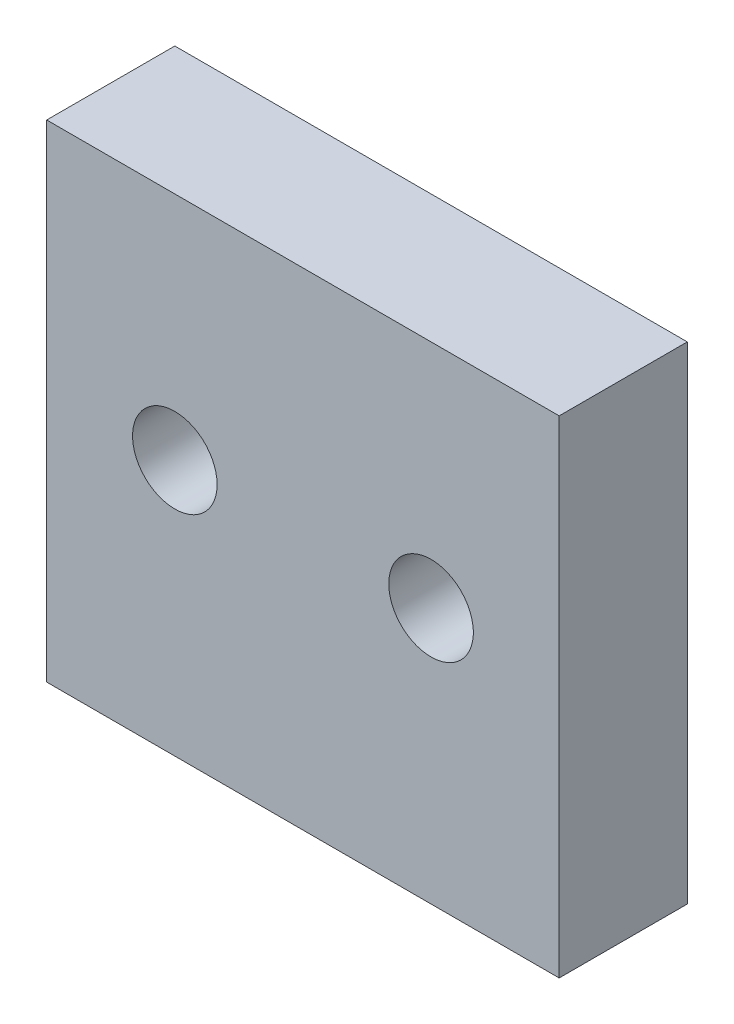
ISO-10303-21;
HEADER;
FILE_DESCRIPTION(('STEP AP214'),'2;1');
FILE_NAME('part.step','',(''),(''),'','','');
FILE_SCHEMA(('AUTOMOTIVE_DESIGN { 1 0 10303 214 1 1 1 1 }'));
ENDSEC;
DATA;
#1=APPLICATION_CONTEXT('core data for automotive mechanical design processes');
#2=APPLICATION_PROTOCOL_DEFINITION('international standard','automotive_design',2000,#1);
#3=PRODUCT_CONTEXT('',#1,'mechanical');
#4=PRODUCT('Part','Part','',(#3));
#5=PRODUCT_RELATED_PRODUCT_CATEGORY('part','',(#4));
#6=PRODUCT_DEFINITION_FORMATION('','',#4);
#7=PRODUCT_DEFINITION_CONTEXT('part definition',#1,'design');
#8=PRODUCT_DEFINITION('design','',#6,#7);
#9=PRODUCT_DEFINITION_SHAPE('','',#8);
#10=(LENGTH_UNIT() NAMED_UNIT(*) SI_UNIT(.MILLI.,.METRE.));
#11=(NAMED_UNIT(*) PLANE_ANGLE_UNIT() SI_UNIT($,.RADIAN.));
#12=(NAMED_UNIT(*) SI_UNIT($,.STERADIAN.) SOLID_ANGLE_UNIT());
#13=UNCERTAINTY_MEASURE_WITH_UNIT(LENGTH_MEASURE(1.E-05),#10,'distance_accuracy_value','');
#14=(GEOMETRIC_REPRESENTATION_CONTEXT(3) GLOBAL_UNCERTAINTY_ASSIGNED_CONTEXT((#13)) GLOBAL_UNIT_ASSIGNED_CONTEXT((#10,
#11,#12)) REPRESENTATION_CONTEXT('',''));
#15=CARTESIAN_POINT('',(0.,0.,0.));
#16=DIRECTION('',(0.,0.,1.));
#17=DIRECTION('',(1.,0.,0.));
#18=AXIS2_PLACEMENT_3D('',#15,#16,#17);
#19=CARTESIAN_POINT('',(0.,0.,5.));
#20=DIRECTION('',(0.,0.,1.));
#21=DIRECTION('',(1.,0.,0.));
#22=AXIS2_PLACEMENT_3D('',#19,#20,#21);
#23=PLANE('',#22);
#24=DIRECTION('',(1.,0.,0.));
#25=VECTOR('',#24,1.);
#26=CARTESIAN_POINT('',(-10.,9.,5.));
#27=LINE('',#26,#25);
#28=CARTESIAN_POINT('',(-10.,9.,5.));
#29=VERTEX_POINT('',#28);
#30=CARTESIAN_POINT('',(10.,9.,5.));
#31=VERTEX_POINT('',#30);
#32=EDGE_CURVE('E133',#29,#31,#27,.T.);
#33=ORIENTED_EDGE('',*,*,#32,.F.);
#34=DIRECTION('',(0.,-1.,0.));
#35=VECTOR('',#34,1.);
#36=CARTESIAN_POINT('',(-10.,10.,5.));
#37=LINE('',#36,#35);
#38=CARTESIAN_POINT('',(-10.,-10.,5.));
#39=VERTEX_POINT('',#38);
#40=EDGE_CURVE('E111',#29,#39,#37,.T.);
#41=ORIENTED_EDGE('',*,*,#40,.T.);
#42=DIRECTION('',(1.,0.,0.));
#43=VECTOR('',#42,1.);
#44=CARTESIAN_POINT('',(-10.,-10.,5.));
#45=LINE('',#44,#43);
#46=CARTESIAN_POINT('',(10.,-10.,5.));
#47=VERTEX_POINT('',#46);
#48=EDGE_CURVE('E68',#39,#47,#45,.T.);
#49=ORIENTED_EDGE('',*,*,#48,.T.);
#50=DIRECTION('',(0.,1.,0.));
#51=VECTOR('',#50,1.);
#52=CARTESIAN_POINT('',(10.,10.,5.));
#53=LINE('',#52,#51);
#54=EDGE_CURVE('E89',#47,#31,#53,.T.);
#55=ORIENTED_EDGE('',*,*,#54,.T.);
#56=EDGE_LOOP('',(#33,#41,#49,#55));
#57=FACE_BOUND('',#56,.T.);
#58=CARTESIAN_POINT('',(-5.,0.,5.));
#59=DIRECTION('',(0.,0.,1.));
#60=DIRECTION('',(1.,0.,0.));
#61=AXIS2_PLACEMENT_3D('',#58,#59,#60);
#62=CIRCLE('',#61,1.65);
#63=CARTESIAN_POINT('',(-3.35,0.,5.));
#64=VERTEX_POINT('',#63);
#65=EDGE_CURVE('E100',#64,#64,#62,.T.);
#66=ORIENTED_EDGE('',*,*,#65,.F.);
#67=EDGE_LOOP('',(#66));
#68=FACE_BOUND('',#67,.T.);
#69=CARTESIAN_POINT('',(5.,0.,5.));
#70=DIRECTION('',(0.,0.,1.));
#71=DIRECTION('',(-1.,0.,0.));
#72=AXIS2_PLACEMENT_3D('',#69,#70,#71);
#73=CIRCLE('',#72,1.65);
#74=CARTESIAN_POINT('',(3.35,0.,5.));
#75=VERTEX_POINT('',#74);
#76=EDGE_CURVE('E118',#75,#75,#73,.T.);
#77=ORIENTED_EDGE('',*,*,#76,.F.);
#78=EDGE_LOOP('',(#77));
#79=FACE_BOUND('',#78,.T.);
#80=ADVANCED_FACE('F43',(#57,#68,#79),#23,.T.);
#81=CARTESIAN_POINT('',(0.,0.,0.));
#82=DIRECTION('',(0.,0.,1.));
#83=DIRECTION('',(1.,0.,0.));
#84=AXIS2_PLACEMENT_3D('',#81,#82,#83);
#85=PLANE('',#84);
#86=DIRECTION('',(0.,-1.,0.));
#87=VECTOR('',#86,1.);
#88=CARTESIAN_POINT('',(-10.,10.,0.));
#89=LINE('',#88,#87);
#90=CARTESIAN_POINT('',(-10.,9.,0.));
#91=VERTEX_POINT('',#90);
#92=CARTESIAN_POINT('',(-10.,-10.,0.));
#93=VERTEX_POINT('',#92);
#94=EDGE_CURVE('E90',#91,#93,#89,.T.);
#95=ORIENTED_EDGE('',*,*,#94,.F.);
#96=DIRECTION('',(1.,0.,0.));
#97=VECTOR('',#96,1.);
#98=CARTESIAN_POINT('',(-10.,9.,0.));
#99=LINE('',#98,#97);
#100=CARTESIAN_POINT('',(10.,9.,0.));
#101=VERTEX_POINT('',#100);
#102=EDGE_CURVE('E59',#91,#101,#99,.T.);
#103=ORIENTED_EDGE('',*,*,#102,.T.);
#104=DIRECTION('',(0.,1.,0.));
#105=VECTOR('',#104,1.);
#106=CARTESIAN_POINT('',(10.,10.,0.));
#107=LINE('',#106,#105);
#108=CARTESIAN_POINT('',(10.,-10.,0.));
#109=VERTEX_POINT('',#108);
#110=EDGE_CURVE('E95',#109,#101,#107,.T.);
#111=ORIENTED_EDGE('',*,*,#110,.F.);
#112=DIRECTION('',(1.,0.,0.));
#113=VECTOR('',#112,1.);
#114=CARTESIAN_POINT('',(-10.,-10.,0.));
#115=LINE('',#114,#113);
#116=EDGE_CURVE('E80',#93,#109,#115,.T.);
#117=ORIENTED_EDGE('',*,*,#116,.F.);
#118=EDGE_LOOP('',(#95,#103,#111,#117));
#119=FACE_BOUND('',#118,.T.);
#120=CARTESIAN_POINT('',(-5.,0.,0.));
#121=DIRECTION('',(0.,0.,1.));
#122=DIRECTION('',(1.,0.,0.));
#123=AXIS2_PLACEMENT_3D('',#120,#121,#122);
#124=CIRCLE('',#123,1.65);
#125=CARTESIAN_POINT('',(-3.35,0.,0.));
#126=VERTEX_POINT('',#125);
#127=EDGE_CURVE('E106',#126,#126,#124,.T.);
#128=ORIENTED_EDGE('',*,*,#127,.T.);
#129=EDGE_LOOP('',(#128));
#130=FACE_BOUND('',#129,.T.);
#131=CARTESIAN_POINT('',(5.,0.,0.));
#132=DIRECTION('',(0.,0.,1.));
#133=DIRECTION('',(-1.,0.,0.));
#134=AXIS2_PLACEMENT_3D('',#131,#132,#133);
#135=CIRCLE('',#134,1.65);
#136=CARTESIAN_POINT('',(3.35,0.,0.));
#137=VERTEX_POINT('',#136);
#138=EDGE_CURVE('E120',#137,#137,#135,.T.);
#139=ORIENTED_EDGE('',*,*,#138,.T.);
#140=EDGE_LOOP('',(#139));
#141=FACE_BOUND('',#140,.T.);
#142=ADVANCED_FACE('F97',(#119,#130,#141),#85,.F.);
#143=CARTESIAN_POINT('',(10.,10.,5.));
#144=DIRECTION('',(-1.,0.,0.));
#145=DIRECTION('',(0.,-1.,0.));
#146=AXIS2_PLACEMENT_3D('',#143,#144,#145);
#147=PLANE('',#146);
#148=ORIENTED_EDGE('',*,*,#110,.T.);
#149=DIRECTION('',(0.,0.,1.));
#150=VECTOR('',#149,1.);
#151=CARTESIAN_POINT('',(10.,9.,0.));
#152=LINE('',#151,#150);
#153=EDGE_CURVE('E124',#101,#31,#152,.T.);
#154=ORIENTED_EDGE('',*,*,#153,.T.);
#155=ORIENTED_EDGE('',*,*,#54,.F.);
#156=DIRECTION('',(0.,0.,-1.));
#157=VECTOR('',#156,1.);
#158=CARTESIAN_POINT('',(10.,-10.,5.));
#159=LINE('',#158,#157);
#160=EDGE_CURVE('E52',#47,#109,#159,.T.);
#161=ORIENTED_EDGE('',*,*,#160,.T.);
#162=EDGE_LOOP('',(#148,#154,#155,#161));
#163=FACE_BOUND('',#162,.T.);
#164=ADVANCED_FACE('F45',(#163),#147,.F.);
#165=CARTESIAN_POINT('',(-10.,10.,5.));
#166=DIRECTION('',(1.,0.,0.));
#167=DIRECTION('',(0.,1.,0.));
#168=AXIS2_PLACEMENT_3D('',#165,#166,#167);
#169=PLANE('',#168);
#170=ORIENTED_EDGE('',*,*,#40,.F.);
#171=DIRECTION('',(0.,0.,1.));
#172=VECTOR('',#171,1.);
#173=CARTESIAN_POINT('',(-10.,9.,0.));
#174=LINE('',#173,#172);
#175=EDGE_CURVE('E128',#91,#29,#174,.T.);
#176=ORIENTED_EDGE('',*,*,#175,.F.);
#177=ORIENTED_EDGE('',*,*,#94,.T.);
#178=DIRECTION('',(0.,0.,-1.));
#179=VECTOR('',#178,1.);
#180=CARTESIAN_POINT('',(-10.,-10.,5.));
#181=LINE('',#180,#179);
#182=EDGE_CURVE('E11',#39,#93,#181,.T.);
#183=ORIENTED_EDGE('',*,*,#182,.F.);
#184=EDGE_LOOP('',(#170,#176,#177,#183));
#185=FACE_BOUND('',#184,.T.);
#186=ADVANCED_FACE('F162',(#185),#169,.F.);
#187=CARTESIAN_POINT('',(-10.,-10.,5.));
#188=DIRECTION('',(0.,1.,0.));
#189=DIRECTION('',(0.,0.,1.));
#190=AXIS2_PLACEMENT_3D('',#187,#188,#189);
#191=PLANE('',#190);
#192=ORIENTED_EDGE('',*,*,#116,.T.);
#193=ORIENTED_EDGE('',*,*,#160,.F.);
#194=ORIENTED_EDGE('',*,*,#48,.F.);
#195=ORIENTED_EDGE('',*,*,#182,.T.);
#196=EDGE_LOOP('',(#192,#193,#194,#195));
#197=FACE_BOUND('',#196,.T.);
#198=ADVANCED_FACE('F82',(#197),#191,.F.);
#199=CARTESIAN_POINT('',(-5.,0.,5.));
#200=DIRECTION('',(0.,0.,-1.));
#201=DIRECTION('',(-1.,0.,0.));
#202=AXIS2_PLACEMENT_3D('',#199,#200,#201);
#203=CYLINDRICAL_SURFACE('',#202,1.65);
#204=ORIENTED_EDGE('',*,*,#65,.T.);
#205=EDGE_LOOP('',(#204));
#206=FACE_BOUND('',#205,.T.);
#207=ORIENTED_EDGE('',*,*,#127,.F.);
#208=EDGE_LOOP('',(#207));
#209=FACE_BOUND('',#208,.T.);
#210=ADVANCED_FACE('F153',(#206,#209),#203,.F.);
#211=CARTESIAN_POINT('',(5.,0.,5.));
#212=DIRECTION('',(0.,0.,-1.));
#213=DIRECTION('',(-1.,0.,0.));
#214=AXIS2_PLACEMENT_3D('',#211,#212,#213);
#215=CYLINDRICAL_SURFACE('',#214,1.65);
#216=ORIENTED_EDGE('',*,*,#76,.T.);
#217=EDGE_LOOP('',(#216));
#218=FACE_BOUND('',#217,.T.);
#219=ORIENTED_EDGE('',*,*,#138,.F.);
#220=EDGE_LOOP('',(#219));
#221=FACE_BOUND('',#220,.T.);
#222=ADVANCED_FACE('F150',(#218,#221),#215,.F.);
#223=CARTESIAN_POINT('',(-10.,9.,0.));
#224=DIRECTION('',(0.,-1.,0.));
#225=DIRECTION('',(0.,0.,-1.));
#226=AXIS2_PLACEMENT_3D('',#223,#224,#225);
#227=PLANE('',#226);
#228=ORIENTED_EDGE('',*,*,#32,.T.);
#229=ORIENTED_EDGE('',*,*,#153,.F.);
#230=ORIENTED_EDGE('',*,*,#102,.F.);
#231=ORIENTED_EDGE('',*,*,#175,.T.);
#232=EDGE_LOOP('',(#228,#229,#230,#231));
#233=FACE_BOUND('',#232,.T.);
#234=ADVANCED_FACE('F140',(#233),#227,.F.);
#235=CLOSED_SHELL('',(#80,#142,#164,#186,#198,#210,#222,#234));
#236=MANIFOLD_SOLID_BREP('B2',#235);
#237=ADVANCED_BREP_SHAPE_REPRESENTATION('',(#18,#236),#14);
#238=SHAPE_DEFINITION_REPRESENTATION(#9,#237);
ENDSEC;
END-ISO-10303-21;
